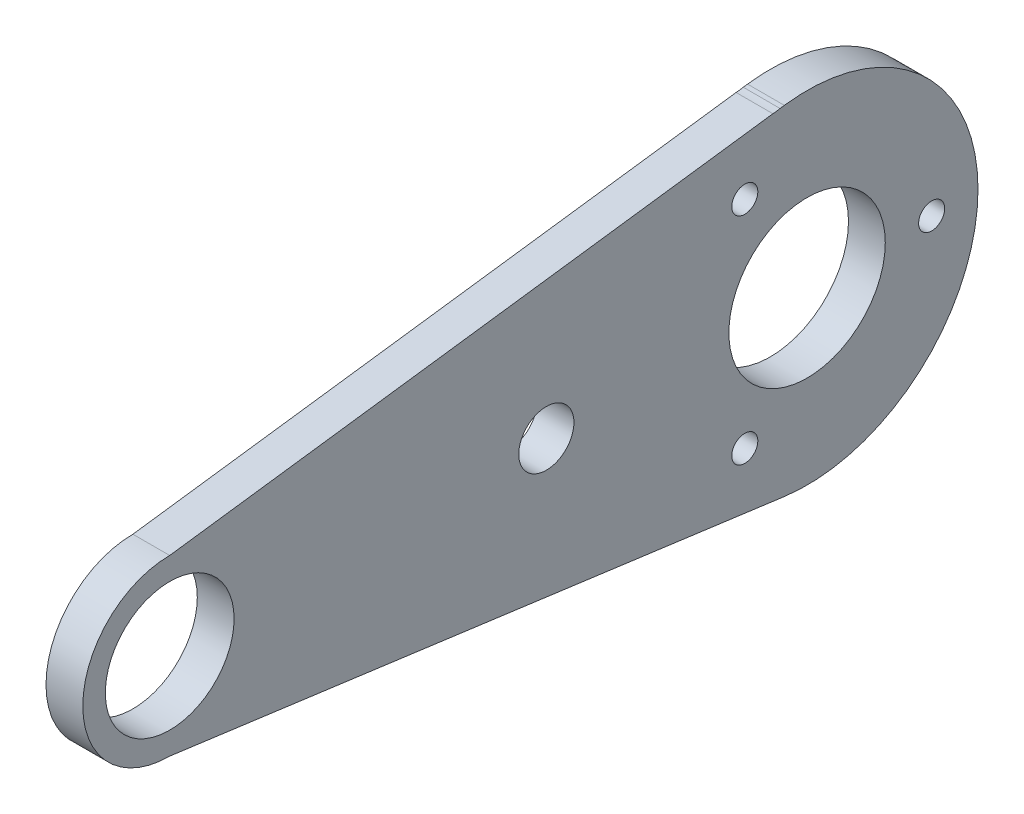
ISO-10303-21;
HEADER;
FILE_DESCRIPTION(('STEP AP214'),'2;1');
FILE_NAME('part.step','',(''),(''),'','','');
FILE_SCHEMA(('AUTOMOTIVE_DESIGN { 1 0 10303 214 1 1 1 1 }'));
ENDSEC;
DATA;
#1=APPLICATION_CONTEXT('core data for automotive mechanical design processes');
#2=APPLICATION_PROTOCOL_DEFINITION('international standard','automotive_design',2000,#1);
#3=PRODUCT_CONTEXT('',#1,'mechanical');
#4=PRODUCT('Part','Part','',(#3));
#5=PRODUCT_RELATED_PRODUCT_CATEGORY('part','',(#4));
#6=PRODUCT_DEFINITION_FORMATION('','',#4);
#7=PRODUCT_DEFINITION_CONTEXT('part definition',#1,'design');
#8=PRODUCT_DEFINITION('design','',#6,#7);
#9=PRODUCT_DEFINITION_SHAPE('','',#8);
#10=(LENGTH_UNIT() NAMED_UNIT(*) SI_UNIT(.MILLI.,.METRE.));
#11=(NAMED_UNIT(*) PLANE_ANGLE_UNIT() SI_UNIT($,.RADIAN.));
#12=(NAMED_UNIT(*) SI_UNIT($,.STERADIAN.) SOLID_ANGLE_UNIT());
#13=UNCERTAINTY_MEASURE_WITH_UNIT(LENGTH_MEASURE(1.E-05),#10,'distance_accuracy_value','');
#14=(GEOMETRIC_REPRESENTATION_CONTEXT(3) GLOBAL_UNCERTAINTY_ASSIGNED_CONTEXT((#13)) GLOBAL_UNIT_ASSIGNED_CONTEXT((#10,
#11,#12)) REPRESENTATION_CONTEXT('',''));
#15=CARTESIAN_POINT('',(0.,0.,0.));
#16=DIRECTION('',(0.,0.,1.));
#17=DIRECTION('',(1.,0.,0.));
#18=AXIS2_PLACEMENT_3D('',#15,#16,#17);
#19=CARTESIAN_POINT('',(3.175,36.7241193894969,-103.6886640625));
#20=DIRECTION('',(-1.,0.,0.));
#21=DIRECTION('',(0.,0.,1.));
#22=AXIS2_PLACEMENT_3D('',#19,#20,#21);
#23=CYLINDRICAL_SURFACE('',#22,7.76249999999999);
#24=CARTESIAN_POINT('',(-3.175,36.7241193894969,-103.6886640625));
#25=DIRECTION('',(1.,0.,0.));
#26=DIRECTION('',(0.,0.,-1.));
#27=AXIS2_PLACEMENT_3D('',#24,#25,#26);
#28=CIRCLE('',#27,7.76249999999999);
#29=CARTESIAN_POINT('',(-3.175,28.9724565460487,-104.098699928621));
#30=VERTEX_POINT('',#29);
#31=CARTESIAN_POINT('',(-3.175,29.1386947004429,-105.337220563409));
#32=VERTEX_POINT('',#31);
#33=EDGE_CURVE('E125',#30,#32,#28,.T.);
#34=ORIENTED_EDGE('',*,*,#33,.F.);
#35=DIRECTION('',(-1.,0.,0.));
#36=VECTOR('',#35,1.);
#37=CARTESIAN_POINT('',(3.175,28.9724565460487,-104.098699928621));
#38=LINE('',#37,#36);
#39=CARTESIAN_POINT('',(3.175,28.9724565460487,-104.098699928621));
#40=VERTEX_POINT('',#39);
#41=EDGE_CURVE('E11',#40,#30,#38,.T.);
#42=ORIENTED_EDGE('',*,*,#41,.F.);
#43=CARTESIAN_POINT('',(3.175,36.7241193894969,-103.6886640625));
#44=DIRECTION('',(1.,0.,0.));
#45=DIRECTION('',(0.,0.,-1.));
#46=AXIS2_PLACEMENT_3D('',#43,#44,#45);
#47=CIRCLE('',#46,7.76249999999999);
#48=CARTESIAN_POINT('',(3.175,29.1386947004429,-105.337220563409));
#49=VERTEX_POINT('',#48);
#50=EDGE_CURVE('E143',#40,#49,#47,.T.);
#51=ORIENTED_EDGE('',*,*,#50,.T.);
#52=DIRECTION('',(-1.,0.,0.));
#53=VECTOR('',#52,1.);
#54=CARTESIAN_POINT('',(3.175,29.1386947004429,-105.337220563409));
#55=LINE('',#54,#53);
#56=EDGE_CURVE('E51',#49,#32,#55,.T.);
#57=ORIENTED_EDGE('',*,*,#56,.T.);
#58=EDGE_LOOP('',(#34,#42,#51,#57));
#59=FACE_BOUND('',#58,.T.);
#60=ADVANCED_FACE('F35',(#59),#23,.F.);
#61=CARTESIAN_POINT('',(3.175,14.7345445536607,1.97771714385494));
#62=DIRECTION('',(0.,0.9911119867321,0.133030183627441));
#63=DIRECTION('',(0.,-0.133030183627441,0.9911119867321));
#64=AXIS2_PLACEMENT_3D('',#61,#62,#63);
#65=PLANE('',#64);
#66=DIRECTION('',(0.,0.133030183627441,-0.9911119867321));
#67=VECTOR('',#66,1.);
#68=CARTESIAN_POINT('',(-3.175,14.7345445536607,1.97771714385494));
#69=LINE('',#68,#67);
#70=CARTESIAN_POINT('',(-3.175,15.,0.));
#71=VERTEX_POINT('',#70);
#72=EDGE_CURVE('E127',#71,#30,#69,.T.);
#73=ORIENTED_EDGE('',*,*,#72,.F.);
#74=DIRECTION('',(-1.,0.,0.));
#75=VECTOR('',#74,1.);
#76=CARTESIAN_POINT('',(3.175,15.,0.));
#77=LINE('',#76,#75);
#78=CARTESIAN_POINT('',(3.175,15.,0.));
#79=VERTEX_POINT('',#78);
#80=EDGE_CURVE('E43',#79,#71,#77,.T.);
#81=ORIENTED_EDGE('',*,*,#80,.F.);
#82=DIRECTION('',(0.,0.133030183627441,-0.9911119867321));
#83=VECTOR('',#82,1.);
#84=CARTESIAN_POINT('',(3.175,14.7345445536607,1.97771714385494));
#85=LINE('',#84,#83);
#86=EDGE_CURVE('E117',#79,#40,#85,.T.);
#87=ORIENTED_EDGE('',*,*,#86,.T.);
#88=ORIENTED_EDGE('',*,*,#41,.T.);
#89=EDGE_LOOP('',(#73,#81,#87,#88));
#90=FACE_BOUND('',#89,.T.);
#91=ADVANCED_FACE('F155',(#90),#65,.T.);
#92=CARTESIAN_POINT('',(3.175,0.,0.));
#93=DIRECTION('',(-1.,0.,0.));
#94=DIRECTION('',(0.,0.,1.));
#95=AXIS2_PLACEMENT_3D('',#92,#93,#94);
#96=CYLINDRICAL_SURFACE('',#95,15.);
#97=CARTESIAN_POINT('',(-3.175,0.,0.));
#98=DIRECTION('',(1.,0.,0.));
#99=DIRECTION('',(0.,0.,-1.));
#100=AXIS2_PLACEMENT_3D('',#97,#98,#99);
#101=CIRCLE('',#100,15.);
#102=CARTESIAN_POINT('',(-3.175,-15.,0.));
#103=VERTEX_POINT('',#102);
#104=EDGE_CURVE('E131',#71,#103,#101,.T.);
#105=ORIENTED_EDGE('',*,*,#104,.T.);
#106=DIRECTION('',(-1.,0.,0.));
#107=VECTOR('',#106,1.);
#108=CARTESIAN_POINT('',(3.175,-15.,0.));
#109=LINE('',#108,#107);
#110=CARTESIAN_POINT('',(3.175,-15.,0.));
#111=VERTEX_POINT('',#110);
#112=EDGE_CURVE('E110',#111,#103,#109,.T.);
#113=ORIENTED_EDGE('',*,*,#112,.F.);
#114=CARTESIAN_POINT('',(3.175,0.,0.));
#115=DIRECTION('',(1.,0.,0.));
#116=DIRECTION('',(0.,0.,-1.));
#117=AXIS2_PLACEMENT_3D('',#114,#115,#116);
#118=CIRCLE('',#117,15.);
#119=EDGE_CURVE('E98',#79,#111,#118,.T.);
#120=ORIENTED_EDGE('',*,*,#119,.F.);
#121=ORIENTED_EDGE('',*,*,#80,.T.);
#122=EDGE_LOOP('',(#105,#113,#120,#121));
#123=FACE_BOUND('',#122,.T.);
#124=ADVANCED_FACE('F148',(#123),#96,.T.);
#125=CARTESIAN_POINT('',(3.175,-14.7345445536607,1.97771714385494));
#126=DIRECTION('',(0.,0.9911119867321,-0.133030183627441));
#127=DIRECTION('',(0.,0.133030183627441,0.9911119867321));
#128=AXIS2_PLACEMENT_3D('',#125,#126,#127);
#129=PLANE('',#128);
#130=DIRECTION('',(0.,-0.133030183627441,-0.9911119867321));
#131=VECTOR('',#130,1.);
#132=CARTESIAN_POINT('',(-3.175,-14.7345445536607,1.97771714385494));
#133=LINE('',#132,#131);
#134=CARTESIAN_POINT('',(-3.175,-29.2378036085969,-106.07560958299));
#135=VERTEX_POINT('',#134);
#136=EDGE_CURVE('E107',#103,#135,#133,.T.);
#137=ORIENTED_EDGE('',*,*,#136,.T.);
#138=DIRECTION('',(-1.,0.,0.));
#139=VECTOR('',#138,1.);
#140=CARTESIAN_POINT('',(3.175,-29.2378036085969,-106.07560958299));
#141=LINE('',#140,#139);
#142=CARTESIAN_POINT('',(3.175,-29.2378036085969,-106.07560958299));
#143=VERTEX_POINT('',#142);
#144=EDGE_CURVE('E104',#143,#135,#141,.T.);
#145=ORIENTED_EDGE('',*,*,#144,.F.);
#146=DIRECTION('',(0.,-0.133030183627441,-0.9911119867321));
#147=VECTOR('',#146,1.);
#148=CARTESIAN_POINT('',(3.175,-14.7345445536607,1.97771714385494));
#149=LINE('',#148,#147);
#150=EDGE_CURVE('E89',#111,#143,#149,.T.);
#151=ORIENTED_EDGE('',*,*,#150,.F.);
#152=ORIENTED_EDGE('',*,*,#112,.T.);
#153=EDGE_LOOP('',(#137,#145,#151,#152));
#154=FACE_BOUND('',#153,.T.);
#155=ADVANCED_FACE('F105',(#154),#129,.F.);
#156=CARTESIAN_POINT('',(3.175,0.,-110.));
#157=DIRECTION('',(-1.,0.,0.));
#158=DIRECTION('',(0.,0.,1.));
#159=AXIS2_PLACEMENT_3D('',#156,#157,#158);
#160=CYLINDRICAL_SURFACE('',#159,29.5);
#161=CARTESIAN_POINT('',(-3.175,0.,-110.));
#162=DIRECTION('',(1.,0.,0.));
#163=DIRECTION('',(0.,0.,-1.));
#164=AXIS2_PLACEMENT_3D('',#161,#162,#163);
#165=CIRCLE('',#164,29.5);
#166=CARTESIAN_POINT('',(-3.175,29.2378036085969,-106.07560958299));
#167=VERTEX_POINT('',#166);
#168=EDGE_CURVE('E135',#135,#167,#165,.T.);
#169=ORIENTED_EDGE('',*,*,#168,.T.);
#170=DIRECTION('',(-1.,0.,0.));
#171=VECTOR('',#170,1.);
#172=CARTESIAN_POINT('',(3.175,29.2378036085969,-106.07560958299));
#173=LINE('',#172,#171);
#174=CARTESIAN_POINT('',(3.175,29.2378036085969,-106.07560958299));
#175=VERTEX_POINT('',#174);
#176=EDGE_CURVE('E71',#175,#167,#173,.T.);
#177=ORIENTED_EDGE('',*,*,#176,.F.);
#178=CARTESIAN_POINT('',(3.175,0.,-110.));
#179=DIRECTION('',(1.,0.,0.));
#180=DIRECTION('',(0.,0.,-1.));
#181=AXIS2_PLACEMENT_3D('',#178,#179,#180);
#182=CIRCLE('',#181,29.5);
#183=EDGE_CURVE('E95',#143,#175,#182,.T.);
#184=ORIENTED_EDGE('',*,*,#183,.F.);
#185=ORIENTED_EDGE('',*,*,#144,.T.);
#186=EDGE_LOOP('',(#169,#177,#184,#185));
#187=FACE_BOUND('',#186,.T.);
#188=ADVANCED_FACE('F112',(#187),#160,.T.);
#189=CARTESIAN_POINT('',(3.175,0.,-110.));
#190=DIRECTION('',(-1.,0.,0.));
#191=DIRECTION('',(0.,0.,1.));
#192=AXIS2_PLACEMENT_3D('',#189,#190,#191);
#193=CYLINDRICAL_SURFACE('',#192,13.5);
#194=CARTESIAN_POINT('',(3.175,0.,-110.));
#195=DIRECTION('',(1.,0.,0.));
#196=DIRECTION('',(0.,0.,-1.));
#197=AXIS2_PLACEMENT_3D('',#194,#195,#196);
#198=CIRCLE('',#197,13.5);
#199=CARTESIAN_POINT('',(3.175,0.,-123.5));
#200=VERTEX_POINT('',#199);
#201=EDGE_CURVE('E115',#200,#200,#198,.T.);
#202=ORIENTED_EDGE('',*,*,#201,.T.);
#203=EDGE_LOOP('',(#202));
#204=FACE_BOUND('',#203,.T.);
#205=CARTESIAN_POINT('',(-3.175,0.,-110.));
#206=DIRECTION('',(1.,0.,0.));
#207=DIRECTION('',(0.,0.,-1.));
#208=AXIS2_PLACEMENT_3D('',#205,#206,#207);
#209=CIRCLE('',#208,13.5);
#210=CARTESIAN_POINT('',(-3.175,0.,-123.5));
#211=VERTEX_POINT('',#210);
#212=EDGE_CURVE('E137',#211,#211,#209,.T.);
#213=ORIENTED_EDGE('',*,*,#212,.F.);
#214=EDGE_LOOP('',(#213));
#215=FACE_BOUND('',#214,.T.);
#216=ADVANCED_FACE('F160',(#204,#215),#193,.F.);
#217=EDGE_CURVE('E132',#32,#167,#69,.T.);
#218=ORIENTED_EDGE('',*,*,#217,.F.);
#219=ORIENTED_EDGE('',*,*,#56,.F.);
#220=EDGE_CURVE('E113',#49,#175,#85,.T.);
#221=ORIENTED_EDGE('',*,*,#220,.T.);
#222=ORIENTED_EDGE('',*,*,#176,.T.);
#223=EDGE_LOOP('',(#218,#219,#221,#222));
#224=FACE_BOUND('',#223,.T.);
#225=ADVANCED_FACE('F157',(#224),#65,.T.);
#226=CARTESIAN_POINT('',(3.175,0.,0.));
#227=DIRECTION('',(-1.,0.,0.));
#228=DIRECTION('',(0.,0.,1.));
#229=AXIS2_PLACEMENT_3D('',#226,#227,#228);
#230=CYLINDRICAL_SURFACE('',#229,11.1125);
#231=CARTESIAN_POINT('',(3.175,0.,0.));
#232=DIRECTION('',(1.,0.,0.));
#233=DIRECTION('',(0.,0.,-1.));
#234=AXIS2_PLACEMENT_3D('',#231,#232,#233);
#235=CIRCLE('',#234,11.1125);
#236=CARTESIAN_POINT('',(3.175,0.,-11.1125));
#237=VERTEX_POINT('',#236);
#238=EDGE_CURVE('E122',#237,#237,#235,.T.);
#239=ORIENTED_EDGE('',*,*,#238,.T.);
#240=EDGE_LOOP('',(#239));
#241=FACE_BOUND('',#240,.T.);
#242=CARTESIAN_POINT('',(-3.175,0.,0.));
#243=DIRECTION('',(1.,0.,0.));
#244=DIRECTION('',(0.,0.,-1.));
#245=AXIS2_PLACEMENT_3D('',#242,#243,#244);
#246=CIRCLE('',#245,11.1125);
#247=CARTESIAN_POINT('',(-3.175,0.,-11.1125));
#248=VERTEX_POINT('',#247);
#249=EDGE_CURVE('E140',#248,#248,#246,.T.);
#250=ORIENTED_EDGE('',*,*,#249,.F.);
#251=EDGE_LOOP('',(#250));
#252=FACE_BOUND('',#251,.T.);
#253=ADVANCED_FACE('F159',(#241,#252),#230,.F.);
#254=CARTESIAN_POINT('',(3.175,0.,0.));
#255=DIRECTION('',(1.,0.,0.));
#256=DIRECTION('',(0.,0.,-1.));
#257=AXIS2_PLACEMENT_3D('',#254,#255,#256);
#258=PLANE('',#257);
#259=CARTESIAN_POINT('',(3.175,0.,-65.));
#260=DIRECTION('',(1.,0.,0.));
#261=DIRECTION('',(0.,0.,-1.));
#262=AXIS2_PLACEMENT_3D('',#259,#260,#261);
#263=CIRCLE('',#262,4.76249999999999);
#264=CARTESIAN_POINT('',(3.175,0.,-69.7625));
#265=VERTEX_POINT('',#264);
#266=EDGE_CURVE('E277',#265,#265,#263,.T.);
#267=ORIENTED_EDGE('',*,*,#266,.F.);
#268=EDGE_LOOP('',(#267));
#269=FACE_BOUND('',#268,.T.);
#270=CARTESIAN_POINT('',(3.175,0.,-131.5));
#271=DIRECTION('',(1.,0.,0.));
#272=DIRECTION('',(0.,0.,-1.));
#273=AXIS2_PLACEMENT_3D('',#270,#271,#272);
#274=CIRCLE('',#273,2.25);
#275=CARTESIAN_POINT('',(3.175,0.,-133.75));
#276=VERTEX_POINT('',#275);
#277=EDGE_CURVE('E279',#276,#276,#274,.T.);
#278=ORIENTED_EDGE('',*,*,#277,.F.);
#279=EDGE_LOOP('',(#278));
#280=FACE_BOUND('',#279,.T.);
#281=CARTESIAN_POINT('',(3.175,-18.6195461813654,-99.25));
#282=DIRECTION('',(1.,0.,0.));
#283=DIRECTION('',(0.,0.,-1.));
#284=AXIS2_PLACEMENT_3D('',#281,#282,#283);
#285=CIRCLE('',#284,2.25);
#286=CARTESIAN_POINT('',(3.175,-18.6195461813654,-101.5));
#287=VERTEX_POINT('',#286);
#288=EDGE_CURVE('E287',#287,#287,#285,.T.);
#289=ORIENTED_EDGE('',*,*,#288,.F.);
#290=EDGE_LOOP('',(#289));
#291=FACE_BOUND('',#290,.T.);
#292=CARTESIAN_POINT('',(3.175,18.6195461813655,-99.25));
#293=DIRECTION('',(1.,0.,0.));
#294=DIRECTION('',(0.,0.,-1.));
#295=AXIS2_PLACEMENT_3D('',#292,#293,#294);
#296=CIRCLE('',#295,2.25);
#297=CARTESIAN_POINT('',(3.175,18.6195461813655,-101.5));
#298=VERTEX_POINT('',#297);
#299=EDGE_CURVE('E293',#298,#298,#296,.T.);
#300=ORIENTED_EDGE('',*,*,#299,.F.);
#301=EDGE_LOOP('',(#300));
#302=FACE_BOUND('',#301,.T.);
#303=ORIENTED_EDGE('',*,*,#50,.F.);
#304=ORIENTED_EDGE('',*,*,#86,.F.);
#305=ORIENTED_EDGE('',*,*,#119,.T.);
#306=ORIENTED_EDGE('',*,*,#150,.T.);
#307=ORIENTED_EDGE('',*,*,#183,.T.);
#308=ORIENTED_EDGE('',*,*,#220,.F.);
#309=EDGE_LOOP('',(#303,#304,#305,#306,#307,#308));
#310=FACE_BOUND('',#309,.T.);
#311=ORIENTED_EDGE('',*,*,#201,.F.);
#312=EDGE_LOOP('',(#311));
#313=FACE_BOUND('',#312,.T.);
#314=ORIENTED_EDGE('',*,*,#238,.F.);
#315=EDGE_LOOP('',(#314));
#316=FACE_BOUND('',#315,.T.);
#317=ADVANCED_FACE('F91',(#269,#280,#291,#302,#310,#313,#316),#258,.T.);
#318=CARTESIAN_POINT('',(-3.175,0.,0.));
#319=DIRECTION('',(1.,0.,0.));
#320=DIRECTION('',(0.,0.,-1.));
#321=AXIS2_PLACEMENT_3D('',#318,#319,#320);
#322=PLANE('',#321);
#323=CARTESIAN_POINT('',(-3.175,0.,-65.));
#324=DIRECTION('',(1.,0.,0.));
#325=DIRECTION('',(0.,0.,-1.));
#326=AXIS2_PLACEMENT_3D('',#323,#324,#325);
#327=CIRCLE('',#326,4.7625);
#328=CARTESIAN_POINT('',(-3.175,0.,-69.7625));
#329=VERTEX_POINT('',#328);
#330=EDGE_CURVE('E274',#329,#329,#327,.T.);
#331=ORIENTED_EDGE('',*,*,#330,.T.);
#332=EDGE_LOOP('',(#331));
#333=FACE_BOUND('',#332,.T.);
#334=CARTESIAN_POINT('',(-3.175,0.,-131.5));
#335=DIRECTION('',(1.,0.,0.));
#336=DIRECTION('',(0.,0.,-1.));
#337=AXIS2_PLACEMENT_3D('',#334,#335,#336);
#338=CIRCLE('',#337,2.25);
#339=CARTESIAN_POINT('',(-3.175,0.,-133.75));
#340=VERTEX_POINT('',#339);
#341=EDGE_CURVE('E284',#340,#340,#338,.T.);
#342=ORIENTED_EDGE('',*,*,#341,.T.);
#343=EDGE_LOOP('',(#342));
#344=FACE_BOUND('',#343,.T.);
#345=CARTESIAN_POINT('',(-3.175,-18.6195461813654,-99.25));
#346=DIRECTION('',(1.,0.,0.));
#347=DIRECTION('',(0.,0.,-1.));
#348=AXIS2_PLACEMENT_3D('',#345,#346,#347);
#349=CIRCLE('',#348,2.25);
#350=CARTESIAN_POINT('',(-3.175,-18.6195461813654,-101.5));
#351=VERTEX_POINT('',#350);
#352=EDGE_CURVE('E290',#351,#351,#349,.T.);
#353=ORIENTED_EDGE('',*,*,#352,.T.);
#354=EDGE_LOOP('',(#353));
#355=FACE_BOUND('',#354,.T.);
#356=CARTESIAN_POINT('',(-3.175,18.6195461813655,-99.25));
#357=DIRECTION('',(1.,0.,0.));
#358=DIRECTION('',(0.,0.,-1.));
#359=AXIS2_PLACEMENT_3D('',#356,#357,#358);
#360=CIRCLE('',#359,2.25);
#361=CARTESIAN_POINT('',(-3.175,18.6195461813655,-101.5));
#362=VERTEX_POINT('',#361);
#363=EDGE_CURVE('E128',#362,#362,#360,.T.);
#364=ORIENTED_EDGE('',*,*,#363,.T.);
#365=EDGE_LOOP('',(#364));
#366=FACE_BOUND('',#365,.T.);
#367=ORIENTED_EDGE('',*,*,#33,.T.);
#368=ORIENTED_EDGE('',*,*,#217,.T.);
#369=ORIENTED_EDGE('',*,*,#168,.F.);
#370=ORIENTED_EDGE('',*,*,#136,.F.);
#371=ORIENTED_EDGE('',*,*,#104,.F.);
#372=ORIENTED_EDGE('',*,*,#72,.T.);
#373=EDGE_LOOP('',(#367,#368,#369,#370,#371,#372));
#374=FACE_BOUND('',#373,.T.);
#375=ORIENTED_EDGE('',*,*,#212,.T.);
#376=EDGE_LOOP('',(#375));
#377=FACE_BOUND('',#376,.T.);
#378=ORIENTED_EDGE('',*,*,#249,.T.);
#379=EDGE_LOOP('',(#378));
#380=FACE_BOUND('',#379,.T.);
#381=ADVANCED_FACE('F153',(#333,#344,#355,#366,#374,#377,#380),#322,.F.);
#382=CARTESIAN_POINT('',(3.175,18.6195461813655,-99.25));
#383=DIRECTION('',(1.,0.,0.));
#384=DIRECTION('',(0.,0.,-1.));
#385=AXIS2_PLACEMENT_3D('',#382,#383,#384);
#386=CYLINDRICAL_SURFACE('',#385,2.25);
#387=ORIENTED_EDGE('',*,*,#363,.F.);
#388=EDGE_LOOP('',(#387));
#389=FACE_BOUND('',#388,.T.);
#390=ORIENTED_EDGE('',*,*,#299,.T.);
#391=EDGE_LOOP('',(#390));
#392=FACE_BOUND('',#391,.T.);
#393=ADVANCED_FACE('F216',(#389,#392),#386,.F.);
#394=CARTESIAN_POINT('',(3.175,-18.6195461813654,-99.25));
#395=DIRECTION('',(1.,0.,0.));
#396=DIRECTION('',(0.,0.,-1.));
#397=AXIS2_PLACEMENT_3D('',#394,#395,#396);
#398=CYLINDRICAL_SURFACE('',#397,2.25);
#399=ORIENTED_EDGE('',*,*,#352,.F.);
#400=EDGE_LOOP('',(#399));
#401=FACE_BOUND('',#400,.T.);
#402=ORIENTED_EDGE('',*,*,#288,.T.);
#403=EDGE_LOOP('',(#402));
#404=FACE_BOUND('',#403,.T.);
#405=ADVANCED_FACE('F221',(#401,#404),#398,.F.);
#406=CARTESIAN_POINT('',(3.175,0.,-131.5));
#407=DIRECTION('',(1.,0.,0.));
#408=DIRECTION('',(0.,0.,-1.));
#409=AXIS2_PLACEMENT_3D('',#406,#407,#408);
#410=CYLINDRICAL_SURFACE('',#409,2.25);
#411=ORIENTED_EDGE('',*,*,#341,.F.);
#412=EDGE_LOOP('',(#411));
#413=FACE_BOUND('',#412,.T.);
#414=ORIENTED_EDGE('',*,*,#277,.T.);
#415=EDGE_LOOP('',(#414));
#416=FACE_BOUND('',#415,.T.);
#417=ADVANCED_FACE('F233',(#413,#416),#410,.F.);
#418=CARTESIAN_POINT('',(3.175,0.,-65.));
#419=DIRECTION('',(1.,0.,0.));
#420=DIRECTION('',(0.,0.,-1.));
#421=AXIS2_PLACEMENT_3D('',#418,#419,#420);
#422=CYLINDRICAL_SURFACE('',#421,4.76249999999999);
#423=ORIENTED_EDGE('',*,*,#330,.F.);
#424=EDGE_LOOP('',(#423));
#425=FACE_BOUND('',#424,.T.);
#426=ORIENTED_EDGE('',*,*,#266,.T.);
#427=EDGE_LOOP('',(#426));
#428=FACE_BOUND('',#427,.T.);
#429=ADVANCED_FACE('F243',(#425,#428),#422,.F.);
#430=CLOSED_SHELL('',(#60,#91,#124,#155,#188,#216,#225,#253,#317,#381,#393,#405,#417,#429));
#431=MANIFOLD_SOLID_BREP('B2',#430);
#432=ADVANCED_BREP_SHAPE_REPRESENTATION('',(#18,#431),#14);
#433=SHAPE_DEFINITION_REPRESENTATION(#9,#432);
ENDSEC;
END-ISO-10303-21;
